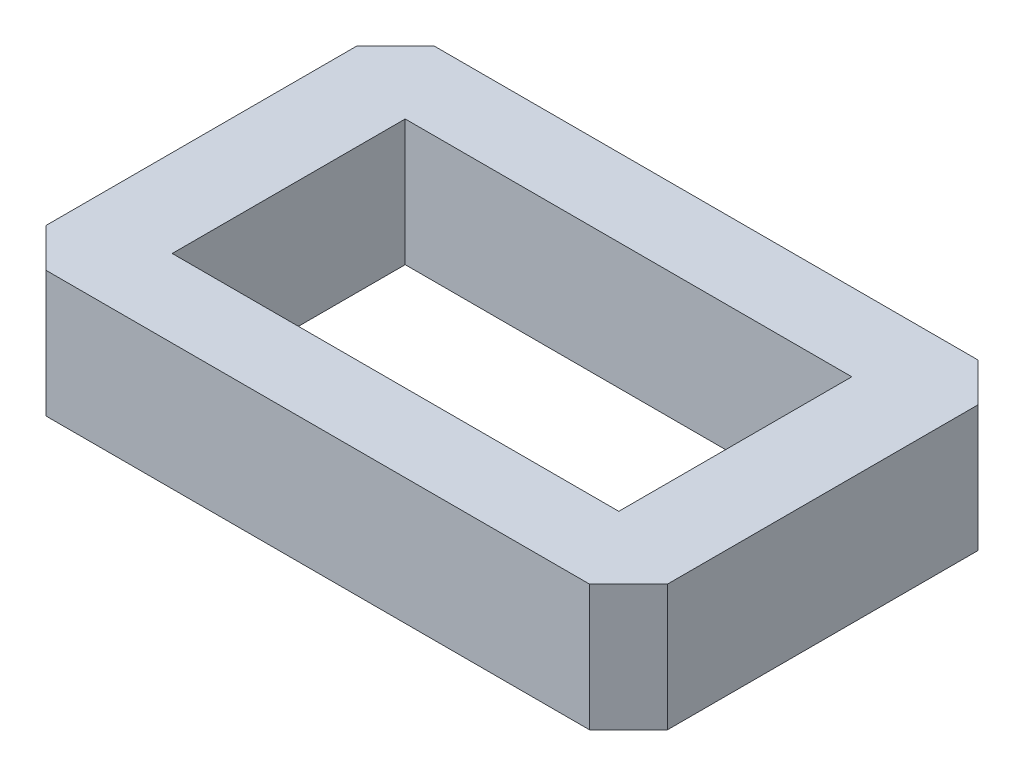
ISO-10303-21;
HEADER;
FILE_DESCRIPTION(('STEP AP214'),'2;1');
FILE_NAME('part.step','',(''),(''),'','','');
FILE_SCHEMA(('AUTOMOTIVE_DESIGN { 1 0 10303 214 1 1 1 1 }'));
ENDSEC;
DATA;
#1=APPLICATION_CONTEXT('core data for automotive mechanical design processes');
#2=APPLICATION_PROTOCOL_DEFINITION('international standard','automotive_design',2000,#1);
#3=PRODUCT_CONTEXT('',#1,'mechanical');
#4=PRODUCT('Part','Part','',(#3));
#5=PRODUCT_RELATED_PRODUCT_CATEGORY('part','',(#4));
#6=PRODUCT_DEFINITION_FORMATION('','',#4);
#7=PRODUCT_DEFINITION_CONTEXT('part definition',#1,'design');
#8=PRODUCT_DEFINITION('design','',#6,#7);
#9=PRODUCT_DEFINITION_SHAPE('','',#8);
#10=(LENGTH_UNIT() NAMED_UNIT(*) SI_UNIT(.MILLI.,.METRE.));
#11=(NAMED_UNIT(*) PLANE_ANGLE_UNIT() SI_UNIT($,.RADIAN.));
#12=(NAMED_UNIT(*) SI_UNIT($,.STERADIAN.) SOLID_ANGLE_UNIT());
#13=UNCERTAINTY_MEASURE_WITH_UNIT(LENGTH_MEASURE(1.E-05),#10,'distance_accuracy_value','');
#14=(GEOMETRIC_REPRESENTATION_CONTEXT(3) GLOBAL_UNCERTAINTY_ASSIGNED_CONTEXT((#13)) GLOBAL_UNIT_ASSIGNED_CONTEXT((#10,
#11,#12)) REPRESENTATION_CONTEXT('',''));
#15=CARTESIAN_POINT('',(0.,0.,0.));
#16=DIRECTION('',(0.,0.,1.));
#17=DIRECTION('',(1.,0.,0.));
#18=AXIS2_PLACEMENT_3D('',#15,#16,#17);
#19=CARTESIAN_POINT('',(16.,6.5,10.));
#20=DIRECTION('',(-1.,0.,0.));
#21=DIRECTION('',(0.,0.,1.));
#22=AXIS2_PLACEMENT_3D('',#19,#20,#21);
#23=PLANE('',#22);
#24=DIRECTION('',(0.,0.,-1.));
#25=VECTOR('',#24,1.);
#26=CARTESIAN_POINT('',(16.,0.,10.));
#27=LINE('',#26,#25);
#28=CARTESIAN_POINT('',(16.,0.,8.));
#29=VERTEX_POINT('',#28);
#30=CARTESIAN_POINT('',(16.,0.,-7.99999999999999));
#31=VERTEX_POINT('',#30);
#32=EDGE_CURVE('E171',#29,#31,#27,.T.);
#33=ORIENTED_EDGE('',*,*,#32,.T.);
#34=DIRECTION('',(0.,1.,0.));
#35=VECTOR('',#34,1.);
#36=CARTESIAN_POINT('',(16.,6.5,-7.99999999999999));
#37=LINE('',#36,#35);
#38=CARTESIAN_POINT('',(16.,6.5,-7.99999999999999));
#39=VERTEX_POINT('',#38);
#40=EDGE_CURVE('E223',#31,#39,#37,.T.);
#41=ORIENTED_EDGE('',*,*,#40,.T.);
#42=DIRECTION('',(0.,0.,-1.));
#43=VECTOR('',#42,1.);
#44=CARTESIAN_POINT('',(16.,6.5,10.));
#45=LINE('',#44,#43);
#46=CARTESIAN_POINT('',(16.,6.5,8.));
#47=VERTEX_POINT('',#46);
#48=EDGE_CURVE('E175',#47,#39,#45,.T.);
#49=ORIENTED_EDGE('',*,*,#48,.F.);
#50=DIRECTION('',(0.,-1.,0.));
#51=VECTOR('',#50,1.);
#52=CARTESIAN_POINT('',(16.,6.5,8.));
#53=LINE('',#52,#51);
#54=EDGE_CURVE('E220',#47,#29,#53,.T.);
#55=ORIENTED_EDGE('',*,*,#54,.T.);
#56=EDGE_LOOP('',(#33,#41,#49,#55));
#57=FACE_BOUND('',#56,.T.);
#58=ADVANCED_FACE('F41',(#57),#23,.F.);
#59=CARTESIAN_POINT('',(-16.,6.5,-10.));
#60=DIRECTION('',(0.,0.,1.));
#61=DIRECTION('',(1.,0.,0.));
#62=AXIS2_PLACEMENT_3D('',#59,#60,#61);
#63=PLANE('',#62);
#64=DIRECTION('',(-1.,0.,0.));
#65=VECTOR('',#64,1.);
#66=CARTESIAN_POINT('',(-16.,0.,-10.));
#67=LINE('',#66,#65);
#68=CARTESIAN_POINT('',(14.,0.,-10.));
#69=VERTEX_POINT('',#68);
#70=CARTESIAN_POINT('',(-14.,0.,-10.));
#71=VERTEX_POINT('',#70);
#72=EDGE_CURVE('E189',#69,#71,#67,.T.);
#73=ORIENTED_EDGE('',*,*,#72,.T.);
#74=DIRECTION('',(0.,1.,0.));
#75=VECTOR('',#74,1.);
#76=CARTESIAN_POINT('',(-14.,6.5,-10.));
#77=LINE('',#76,#75);
#78=CARTESIAN_POINT('',(-14.,6.5,-10.));
#79=VERTEX_POINT('',#78);
#80=EDGE_CURVE('E211',#71,#79,#77,.T.);
#81=ORIENTED_EDGE('',*,*,#80,.T.);
#82=DIRECTION('',(-1.,0.,0.));
#83=VECTOR('',#82,1.);
#84=CARTESIAN_POINT('',(-16.,6.5,-10.));
#85=LINE('',#84,#83);
#86=CARTESIAN_POINT('',(14.,6.5,-10.));
#87=VERTEX_POINT('',#86);
#88=EDGE_CURVE('E178',#87,#79,#85,.T.);
#89=ORIENTED_EDGE('',*,*,#88,.F.);
#90=DIRECTION('',(0.,-1.,0.));
#91=VECTOR('',#90,1.);
#92=CARTESIAN_POINT('',(14.,6.5,-10.));
#93=LINE('',#92,#91);
#94=EDGE_CURVE('E208',#87,#69,#93,.T.);
#95=ORIENTED_EDGE('',*,*,#94,.T.);
#96=EDGE_LOOP('',(#73,#81,#89,#95));
#97=FACE_BOUND('',#96,.T.);
#98=ADVANCED_FACE('F246',(#97),#63,.F.);
#99=CARTESIAN_POINT('',(-16.,6.5,10.));
#100=DIRECTION('',(1.,0.,0.));
#101=DIRECTION('',(0.,0.,-1.));
#102=AXIS2_PLACEMENT_3D('',#99,#100,#101);
#103=PLANE('',#102);
#104=DIRECTION('',(0.,0.,1.));
#105=VECTOR('',#104,1.);
#106=CARTESIAN_POINT('',(-16.,6.5,10.));
#107=LINE('',#106,#105);
#108=CARTESIAN_POINT('',(-16.,6.5,-8.));
#109=VERTEX_POINT('',#108);
#110=CARTESIAN_POINT('',(-16.,6.5,8.));
#111=VERTEX_POINT('',#110);
#112=EDGE_CURVE('E182',#109,#111,#107,.T.);
#113=ORIENTED_EDGE('',*,*,#112,.F.);
#114=DIRECTION('',(0.,-1.,0.));
#115=VECTOR('',#114,1.);
#116=CARTESIAN_POINT('',(-16.,6.5,-8.));
#117=LINE('',#116,#115);
#118=CARTESIAN_POINT('',(-16.,0.,-8.));
#119=VERTEX_POINT('',#118);
#120=EDGE_CURVE('E197',#109,#119,#117,.T.);
#121=ORIENTED_EDGE('',*,*,#120,.T.);
#122=DIRECTION('',(0.,0.,1.));
#123=VECTOR('',#122,1.);
#124=CARTESIAN_POINT('',(-16.,0.,10.));
#125=LINE('',#124,#123);
#126=CARTESIAN_POINT('',(-16.,0.,8.));
#127=VERTEX_POINT('',#126);
#128=EDGE_CURVE('E192',#119,#127,#125,.T.);
#129=ORIENTED_EDGE('',*,*,#128,.T.);
#130=DIRECTION('',(0.,1.,0.));
#131=VECTOR('',#130,1.);
#132=CARTESIAN_POINT('',(-16.,6.5,8.));
#133=LINE('',#132,#131);
#134=EDGE_CURVE('E186',#127,#111,#133,.T.);
#135=ORIENTED_EDGE('',*,*,#134,.T.);
#136=EDGE_LOOP('',(#113,#121,#129,#135));
#137=FACE_BOUND('',#136,.T.);
#138=ADVANCED_FACE('F254',(#137),#103,.F.);
#139=CARTESIAN_POINT('',(-16.,6.5,10.));
#140=DIRECTION('',(0.,0.,-1.));
#141=DIRECTION('',(-1.,0.,0.));
#142=AXIS2_PLACEMENT_3D('',#139,#140,#141);
#143=PLANE('',#142);
#144=DIRECTION('',(1.,0.,0.));
#145=VECTOR('',#144,1.);
#146=CARTESIAN_POINT('',(-16.,0.,10.));
#147=LINE('',#146,#145);
#148=CARTESIAN_POINT('',(-14.,0.,10.));
#149=VERTEX_POINT('',#148);
#150=CARTESIAN_POINT('',(14.,0.,10.));
#151=VERTEX_POINT('',#150);
#152=EDGE_CURVE('E179',#149,#151,#147,.T.);
#153=ORIENTED_EDGE('',*,*,#152,.T.);
#154=DIRECTION('',(0.,1.,0.));
#155=VECTOR('',#154,1.);
#156=CARTESIAN_POINT('',(14.,6.5,10.));
#157=LINE('',#156,#155);
#158=CARTESIAN_POINT('',(14.,6.5,10.));
#159=VERTEX_POINT('',#158);
#160=EDGE_CURVE('E11',#151,#159,#157,.T.);
#161=ORIENTED_EDGE('',*,*,#160,.T.);
#162=DIRECTION('',(1.,0.,0.));
#163=VECTOR('',#162,1.);
#164=CARTESIAN_POINT('',(-16.,6.5,10.));
#165=LINE('',#164,#163);
#166=CARTESIAN_POINT('',(-14.,6.5,10.));
#167=VERTEX_POINT('',#166);
#168=EDGE_CURVE('E184',#167,#159,#165,.T.);
#169=ORIENTED_EDGE('',*,*,#168,.F.);
#170=DIRECTION('',(0.,-1.,0.));
#171=VECTOR('',#170,1.);
#172=CARTESIAN_POINT('',(-14.,6.5,10.));
#173=LINE('',#172,#171);
#174=EDGE_CURVE('E50',#167,#149,#173,.T.);
#175=ORIENTED_EDGE('',*,*,#174,.T.);
#176=EDGE_LOOP('',(#153,#161,#169,#175));
#177=FACE_BOUND('',#176,.T.);
#178=ADVANCED_FACE('F227',(#177),#143,.F.);
#179=CARTESIAN_POINT('',(0.,6.5,0.));
#180=DIRECTION('',(0.,-1.,0.));
#181=DIRECTION('',(0.,0.,-1.));
#182=AXIS2_PLACEMENT_3D('',#179,#180,#181);
#183=PLANE('',#182);
#184=DIRECTION('',(-1.,0.,0.));
#185=VECTOR('',#184,1.);
#186=CARTESIAN_POINT('',(-11.5,6.5,-6.));
#187=LINE('',#186,#185);
#188=CARTESIAN_POINT('',(11.5,6.5,-6.));
#189=VERTEX_POINT('',#188);
#190=CARTESIAN_POINT('',(-11.5,6.5,-6.));
#191=VERTEX_POINT('',#190);
#192=EDGE_CURVE('E165',#189,#191,#187,.T.);
#193=ORIENTED_EDGE('',*,*,#192,.F.);
#194=DIRECTION('',(0.,0.,-1.));
#195=VECTOR('',#194,1.);
#196=CARTESIAN_POINT('',(11.5,6.5,6.));
#197=LINE('',#196,#195);
#198=CARTESIAN_POINT('',(11.5,6.5,6.));
#199=VERTEX_POINT('',#198);
#200=EDGE_CURVE('E138',#199,#189,#197,.T.);
#201=ORIENTED_EDGE('',*,*,#200,.F.);
#202=DIRECTION('',(1.,0.,0.));
#203=VECTOR('',#202,1.);
#204=CARTESIAN_POINT('',(-11.5,6.5,6.));
#205=LINE('',#204,#203);
#206=CARTESIAN_POINT('',(-11.5,6.5,6.));
#207=VERTEX_POINT('',#206);
#208=EDGE_CURVE('E156',#207,#199,#205,.T.);
#209=ORIENTED_EDGE('',*,*,#208,.F.);
#210=DIRECTION('',(0.,0.,1.));
#211=VECTOR('',#210,1.);
#212=CARTESIAN_POINT('',(-11.5,6.5,6.));
#213=LINE('',#212,#211);
#214=EDGE_CURVE('E159',#191,#207,#213,.T.);
#215=ORIENTED_EDGE('',*,*,#214,.F.);
#216=EDGE_LOOP('',(#193,#201,#209,#215));
#217=FACE_BOUND('',#216,.T.);
#218=ORIENTED_EDGE('',*,*,#88,.T.);
#219=DIRECTION('',(0.707106781186548,0.,-0.707106781186547));
#220=VECTOR('',#219,1.);
#221=CARTESIAN_POINT('',(-16.,6.5,-8.));
#222=LINE('',#221,#220);
#223=EDGE_CURVE('E218',#79,#109,#222,.F.);
#224=ORIENTED_EDGE('',*,*,#223,.T.);
#225=ORIENTED_EDGE('',*,*,#112,.T.);
#226=DIRECTION('',(-0.707106781186546,0.,-0.707106781186549));
#227=VECTOR('',#226,1.);
#228=CARTESIAN_POINT('',(-14.,6.5,10.));
#229=LINE('',#228,#227);
#230=EDGE_CURVE('E62',#111,#167,#229,.F.);
#231=ORIENTED_EDGE('',*,*,#230,.T.);
#232=ORIENTED_EDGE('',*,*,#168,.T.);
#233=DIRECTION('',(-0.707106781186549,0.,0.707106781186546));
#234=VECTOR('',#233,1.);
#235=CARTESIAN_POINT('',(16.,6.5,8.));
#236=LINE('',#235,#234);
#237=EDGE_CURVE('E214',#159,#47,#236,.F.);
#238=ORIENTED_EDGE('',*,*,#237,.T.);
#239=ORIENTED_EDGE('',*,*,#48,.T.);
#240=DIRECTION('',(0.707106781186546,0.,0.707106781186549));
#241=VECTOR('',#240,1.);
#242=CARTESIAN_POINT('',(14.,6.5,-10.));
#243=LINE('',#242,#241);
#244=EDGE_CURVE('E216',#39,#87,#243,.F.);
#245=ORIENTED_EDGE('',*,*,#244,.T.);
#246=EDGE_LOOP('',(#218,#224,#225,#231,#232,#238,#239,#245));
#247=FACE_BOUND('',#246,.T.);
#248=ADVANCED_FACE('F239',(#217,#247),#183,.F.);
#249=CARTESIAN_POINT('',(0.,0.,0.));
#250=DIRECTION('',(0.,-1.,0.));
#251=DIRECTION('',(0.,0.,-1.));
#252=AXIS2_PLACEMENT_3D('',#249,#250,#251);
#253=PLANE('',#252);
#254=DIRECTION('',(0.,0.,-1.));
#255=VECTOR('',#254,1.);
#256=CARTESIAN_POINT('',(11.5,0.,6.));
#257=LINE('',#256,#255);
#258=CARTESIAN_POINT('',(11.5,0.,6.));
#259=VERTEX_POINT('',#258);
#260=CARTESIAN_POINT('',(11.5,0.,-6.));
#261=VERTEX_POINT('',#260);
#262=EDGE_CURVE('E135',#259,#261,#257,.T.);
#263=ORIENTED_EDGE('',*,*,#262,.T.);
#264=DIRECTION('',(-1.,0.,0.));
#265=VECTOR('',#264,1.);
#266=CARTESIAN_POINT('',(-11.5,0.,-6.));
#267=LINE('',#266,#265);
#268=CARTESIAN_POINT('',(-11.5,0.,-6.));
#269=VERTEX_POINT('',#268);
#270=EDGE_CURVE('E147',#261,#269,#267,.T.);
#271=ORIENTED_EDGE('',*,*,#270,.T.);
#272=DIRECTION('',(0.,0.,1.));
#273=VECTOR('',#272,1.);
#274=CARTESIAN_POINT('',(-11.5,0.,6.));
#275=LINE('',#274,#273);
#276=CARTESIAN_POINT('',(-11.5,0.,6.));
#277=VERTEX_POINT('',#276);
#278=EDGE_CURVE('E151',#269,#277,#275,.T.);
#279=ORIENTED_EDGE('',*,*,#278,.T.);
#280=DIRECTION('',(1.,0.,0.));
#281=VECTOR('',#280,1.);
#282=CARTESIAN_POINT('',(-11.5,0.,6.));
#283=LINE('',#282,#281);
#284=EDGE_CURVE('E143',#277,#259,#283,.T.);
#285=ORIENTED_EDGE('',*,*,#284,.T.);
#286=EDGE_LOOP('',(#263,#271,#279,#285));
#287=FACE_BOUND('',#286,.T.);
#288=ORIENTED_EDGE('',*,*,#128,.F.);
#289=DIRECTION('',(-0.707106781186548,0.,0.707106781186547));
#290=VECTOR('',#289,1.);
#291=CARTESIAN_POINT('',(-12.,0.,-12.));
#292=LINE('',#291,#290);
#293=EDGE_CURVE('E206',#119,#71,#292,.F.);
#294=ORIENTED_EDGE('',*,*,#293,.T.);
#295=ORIENTED_EDGE('',*,*,#72,.F.);
#296=DIRECTION('',(-0.707106781186546,0.,-0.707106781186549));
#297=VECTOR('',#296,1.);
#298=CARTESIAN_POINT('',(12.,0.,-12.));
#299=LINE('',#298,#297);
#300=EDGE_CURVE('E204',#69,#31,#299,.F.);
#301=ORIENTED_EDGE('',*,*,#300,.T.);
#302=ORIENTED_EDGE('',*,*,#32,.F.);
#303=DIRECTION('',(0.707106781186549,0.,-0.707106781186546));
#304=VECTOR('',#303,1.);
#305=CARTESIAN_POINT('',(12.,0.,12.));
#306=LINE('',#305,#304);
#307=EDGE_CURVE('E202',#29,#151,#306,.F.);
#308=ORIENTED_EDGE('',*,*,#307,.T.);
#309=ORIENTED_EDGE('',*,*,#152,.F.);
#310=DIRECTION('',(0.707106781186546,0.,0.707106781186549));
#311=VECTOR('',#310,1.);
#312=CARTESIAN_POINT('',(-12.,0.,12.));
#313=LINE('',#312,#311);
#314=EDGE_CURVE('E200',#149,#127,#313,.F.);
#315=ORIENTED_EDGE('',*,*,#314,.T.);
#316=EDGE_LOOP('',(#288,#294,#295,#301,#302,#308,#309,#315));
#317=FACE_BOUND('',#316,.T.);
#318=ADVANCED_FACE('F153',(#287,#317),#253,.T.);
#319=CARTESIAN_POINT('',(11.5,0.,6.));
#320=DIRECTION('',(1.,0.,0.));
#321=DIRECTION('',(0.,0.,-1.));
#322=AXIS2_PLACEMENT_3D('',#319,#320,#321);
#323=PLANE('',#322);
#324=ORIENTED_EDGE('',*,*,#200,.T.);
#325=DIRECTION('',(0.,1.,0.));
#326=VECTOR('',#325,1.);
#327=CARTESIAN_POINT('',(11.5,0.,-6.));
#328=LINE('',#327,#326);
#329=EDGE_CURVE('E131',#261,#189,#328,.T.);
#330=ORIENTED_EDGE('',*,*,#329,.F.);
#331=ORIENTED_EDGE('',*,*,#262,.F.);
#332=DIRECTION('',(0.,1.,0.));
#333=VECTOR('',#332,1.);
#334=CARTESIAN_POINT('',(11.5,0.,6.));
#335=LINE('',#334,#333);
#336=EDGE_CURVE('E169',#259,#199,#335,.T.);
#337=ORIENTED_EDGE('',*,*,#336,.T.);
#338=EDGE_LOOP('',(#324,#330,#331,#337));
#339=FACE_BOUND('',#338,.T.);
#340=ADVANCED_FACE('F133',(#339),#323,.F.);
#341=CARTESIAN_POINT('',(-11.5,0.,6.));
#342=DIRECTION('',(0.,0.,1.));
#343=DIRECTION('',(1.,0.,0.));
#344=AXIS2_PLACEMENT_3D('',#341,#342,#343);
#345=PLANE('',#344);
#346=ORIENTED_EDGE('',*,*,#208,.T.);
#347=ORIENTED_EDGE('',*,*,#336,.F.);
#348=ORIENTED_EDGE('',*,*,#284,.F.);
#349=DIRECTION('',(0.,1.,0.));
#350=VECTOR('',#349,1.);
#351=CARTESIAN_POINT('',(-11.5,0.,6.));
#352=LINE('',#351,#350);
#353=EDGE_CURVE('E172',#277,#207,#352,.T.);
#354=ORIENTED_EDGE('',*,*,#353,.T.);
#355=EDGE_LOOP('',(#346,#347,#348,#354));
#356=FACE_BOUND('',#355,.T.);
#357=ADVANCED_FACE('F318',(#356),#345,.F.);
#358=CARTESIAN_POINT('',(-11.5,0.,6.));
#359=DIRECTION('',(-1.,0.,0.));
#360=DIRECTION('',(0.,0.,1.));
#361=AXIS2_PLACEMENT_3D('',#358,#359,#360);
#362=PLANE('',#361);
#363=ORIENTED_EDGE('',*,*,#214,.T.);
#364=ORIENTED_EDGE('',*,*,#353,.F.);
#365=ORIENTED_EDGE('',*,*,#278,.F.);
#366=DIRECTION('',(0.,1.,0.));
#367=VECTOR('',#366,1.);
#368=CARTESIAN_POINT('',(-11.5,0.,-6.));
#369=LINE('',#368,#367);
#370=EDGE_CURVE('E142',#269,#191,#369,.T.);
#371=ORIENTED_EDGE('',*,*,#370,.T.);
#372=EDGE_LOOP('',(#363,#364,#365,#371));
#373=FACE_BOUND('',#372,.T.);
#374=ADVANCED_FACE('F310',(#373),#362,.F.);
#375=CARTESIAN_POINT('',(-11.5,0.,-6.));
#376=DIRECTION('',(0.,0.,-1.));
#377=DIRECTION('',(-1.,0.,0.));
#378=AXIS2_PLACEMENT_3D('',#375,#376,#377);
#379=PLANE('',#378);
#380=ORIENTED_EDGE('',*,*,#192,.T.);
#381=ORIENTED_EDGE('',*,*,#370,.F.);
#382=ORIENTED_EDGE('',*,*,#270,.F.);
#383=ORIENTED_EDGE('',*,*,#329,.T.);
#384=EDGE_LOOP('',(#380,#381,#382,#383));
#385=FACE_BOUND('',#384,.T.);
#386=ADVANCED_FACE('F148',(#385),#379,.F.);
#387=CARTESIAN_POINT('',(-16.,6.5,-8.));
#388=DIRECTION('',(0.707106781186547,0.,0.707106781186548));
#389=DIRECTION('',(0.,-1.,0.));
#390=AXIS2_PLACEMENT_3D('',#387,#388,#389);
#391=PLANE('',#390);
#392=ORIENTED_EDGE('',*,*,#223,.F.);
#393=ORIENTED_EDGE('',*,*,#80,.F.);
#394=ORIENTED_EDGE('',*,*,#293,.F.);
#395=ORIENTED_EDGE('',*,*,#120,.F.);
#396=EDGE_LOOP('',(#392,#393,#394,#395));
#397=FACE_BOUND('',#396,.T.);
#398=ADVANCED_FACE('F251',(#397),#391,.F.);
#399=CARTESIAN_POINT('',(14.,6.5,-10.));
#400=DIRECTION('',(-0.707106781186549,0.,0.707106781186546));
#401=DIRECTION('',(0.,-1.,0.));
#402=AXIS2_PLACEMENT_3D('',#399,#400,#401);
#403=PLANE('',#402);
#404=ORIENTED_EDGE('',*,*,#244,.F.);
#405=ORIENTED_EDGE('',*,*,#40,.F.);
#406=ORIENTED_EDGE('',*,*,#300,.F.);
#407=ORIENTED_EDGE('',*,*,#94,.F.);
#408=EDGE_LOOP('',(#404,#405,#406,#407));
#409=FACE_BOUND('',#408,.T.);
#410=ADVANCED_FACE('F243',(#409),#403,.F.);
#411=CARTESIAN_POINT('',(16.,6.5,8.));
#412=DIRECTION('',(-0.707106781186546,0.,-0.707106781186549));
#413=DIRECTION('',(0.,-1.,0.));
#414=AXIS2_PLACEMENT_3D('',#411,#412,#413);
#415=PLANE('',#414);
#416=ORIENTED_EDGE('',*,*,#237,.F.);
#417=ORIENTED_EDGE('',*,*,#160,.F.);
#418=ORIENTED_EDGE('',*,*,#307,.F.);
#419=ORIENTED_EDGE('',*,*,#54,.F.);
#420=EDGE_LOOP('',(#416,#417,#418,#419));
#421=FACE_BOUND('',#420,.T.);
#422=ADVANCED_FACE('F234',(#421),#415,.F.);
#423=CARTESIAN_POINT('',(-14.,6.5,10.));
#424=DIRECTION('',(0.707106781186549,0.,-0.707106781186546));
#425=DIRECTION('',(0.,-1.,0.));
#426=AXIS2_PLACEMENT_3D('',#423,#424,#425);
#427=PLANE('',#426);
#428=ORIENTED_EDGE('',*,*,#230,.F.);
#429=ORIENTED_EDGE('',*,*,#134,.F.);
#430=ORIENTED_EDGE('',*,*,#314,.F.);
#431=ORIENTED_EDGE('',*,*,#174,.F.);
#432=EDGE_LOOP('',(#428,#429,#430,#431));
#433=FACE_BOUND('',#432,.T.);
#434=ADVANCED_FACE('F44',(#433),#427,.F.);
#435=CLOSED_SHELL('',(#58,#98,#138,#178,#248,#318,#340,#357,#374,#386,#398,#410,#422,#434));
#436=MANIFOLD_SOLID_BREP('B2',#435);
#437=ADVANCED_BREP_SHAPE_REPRESENTATION('',(#18,#436),#14);
#438=SHAPE_DEFINITION_REPRESENTATION(#9,#437);
ENDSEC;
END-ISO-10303-21;
